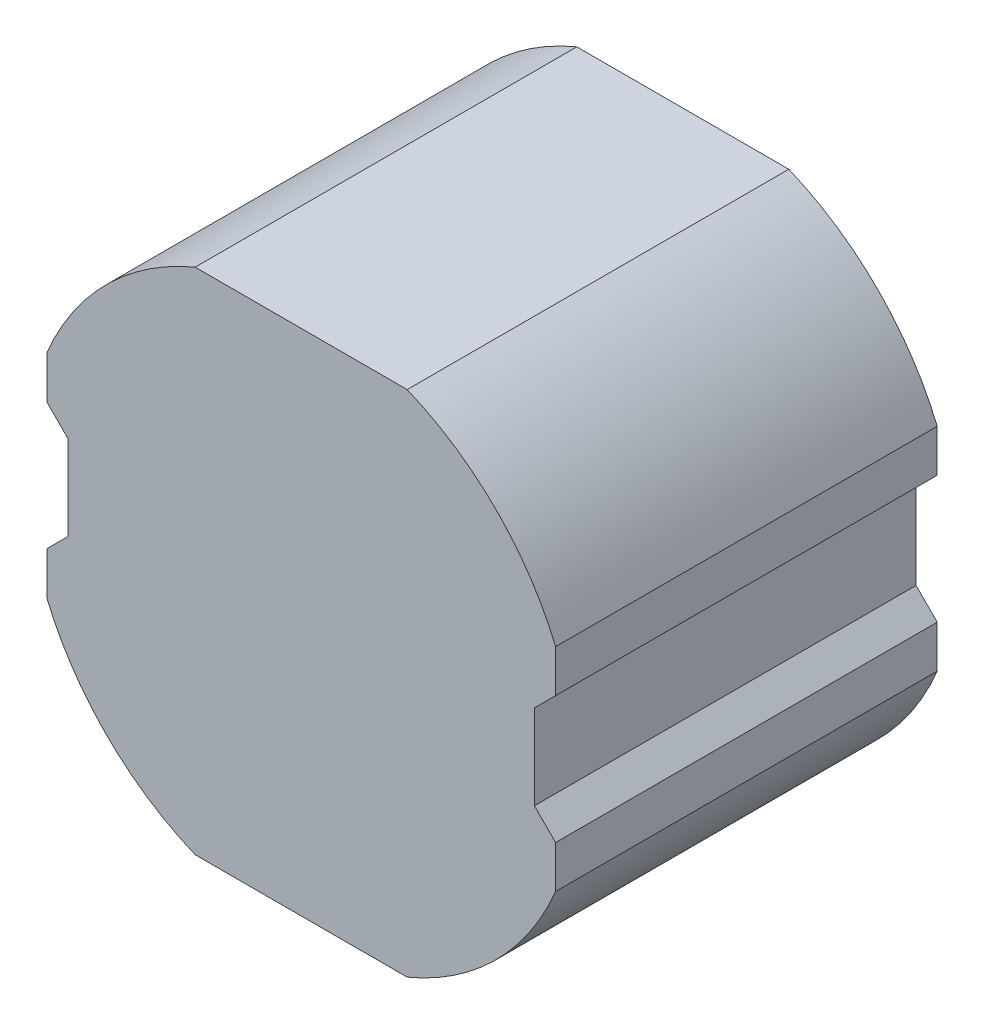
ISO-10303-21;
HEADER;
FILE_DESCRIPTION(('STEP AP214'),'2;1');
FILE_NAME('part.step','',(''),(''),'','','');
FILE_SCHEMA(('AUTOMOTIVE_DESIGN { 1 0 10303 214 1 1 1 1 }'));
ENDSEC;
DATA;
#1=APPLICATION_CONTEXT('core data for automotive mechanical design processes');
#2=APPLICATION_PROTOCOL_DEFINITION('international standard','automotive_design',2000,#1);
#3=PRODUCT_CONTEXT('',#1,'mechanical');
#4=PRODUCT('Part','Part','',(#3));
#5=PRODUCT_RELATED_PRODUCT_CATEGORY('part','',(#4));
#6=PRODUCT_DEFINITION_FORMATION('','',#4);
#7=PRODUCT_DEFINITION_CONTEXT('part definition',#1,'design');
#8=PRODUCT_DEFINITION('design','',#6,#7);
#9=PRODUCT_DEFINITION_SHAPE('','',#8);
#10=(LENGTH_UNIT() NAMED_UNIT(*) SI_UNIT(.MILLI.,.METRE.));
#11=(NAMED_UNIT(*) PLANE_ANGLE_UNIT() SI_UNIT($,.RADIAN.));
#12=(NAMED_UNIT(*) SI_UNIT($,.STERADIAN.) SOLID_ANGLE_UNIT());
#13=UNCERTAINTY_MEASURE_WITH_UNIT(LENGTH_MEASURE(1.E-05),#10,'distance_accuracy_value','');
#14=(GEOMETRIC_REPRESENTATION_CONTEXT(3) GLOBAL_UNCERTAINTY_ASSIGNED_CONTEXT((#13)) GLOBAL_UNIT_ASSIGNED_CONTEXT((#10,
#11,#12)) REPRESENTATION_CONTEXT('',''));
#15=CARTESIAN_POINT('',(0.,0.,0.));
#16=DIRECTION('',(0.,0.,1.));
#17=DIRECTION('',(1.,0.,0.));
#18=AXIS2_PLACEMENT_3D('',#15,#16,#17);
#19=CARTESIAN_POINT('',(2.749999938533,-0.509999988824,-0.01));
#20=CARTESIAN_POINT('',(2.749999938533,-0.509999988824,4.51));
#21=CARTESIAN_POINT('',(2.749999938533,0.509999988824,-0.01));
#22=CARTESIAN_POINT('',(2.749999938533,0.509999988824,4.51));
#23=(BOUNDED_SURFACE() B_SPLINE_SURFACE(1,1,((#19,#20),(#21,#22)),.UNSPECIFIED.,.F.,.F.,
.F.) B_SPLINE_SURFACE_WITH_KNOTS((2,2),(2,2),(-0.001,0.100999997765),(-0.001,0.451),
.UNSPECIFIED.) GEOMETRIC_REPRESENTATION_ITEM() RATIONAL_B_SPLINE_SURFACE(((1.,1.),(1.,1.))) REPRESENTATION_ITEM('') SURFACE());
#24=CARTESIAN_POINT('',(2.749999938533,0.499999988824,0.));
#25=CARTESIAN_POINT('',(2.749999938533,-0.499999988824,0.));
#26=(BOUNDED_CURVE() B_SPLINE_CURVE(1,(#24,#25),.UNSPECIFIED.,.F.,
.F.) B_SPLINE_CURVE_WITH_KNOTS((2,2),(0.,0.09999999776483),
.UNSPECIFIED.) CURVE() GEOMETRIC_REPRESENTATION_ITEM() RATIONAL_B_SPLINE_CURVE((1.,1.)) REPRESENTATION_ITEM(''));
#27=CARTESIAN_POINT('',(2.749999938533,0.499999988824,0.));
#28=VERTEX_POINT('',#27);
#29=CARTESIAN_POINT('',(2.749999938533,-0.499999988824,0.));
#30=VERTEX_POINT('',#29);
#31=EDGE_CURVE('E287',#28,#30,#26,.T.);
#32=CARTESIAN_POINT('',(2.749999938533,0.499999988824,0.));
#33=CARTESIAN_POINT('',(2.749999938533,0.499999988824,4.5));
#34=(BOUNDED_CURVE() B_SPLINE_CURVE(1,(#32,#33),.UNSPECIFIED.,.F.,
.F.) B_SPLINE_CURVE_WITH_KNOTS((2,2),(0.,0.45),
.UNSPECIFIED.) CURVE() GEOMETRIC_REPRESENTATION_ITEM() RATIONAL_B_SPLINE_CURVE((1.,1.)) REPRESENTATION_ITEM(''));
#35=CARTESIAN_POINT('',(2.749999938533,0.499999988824,4.5));
#36=VERTEX_POINT('',#35);
#37=EDGE_CURVE('E310',#28,#36,#34,.T.);
#38=CARTESIAN_POINT('',(2.749999938533,-0.499999988824,4.5));
#39=CARTESIAN_POINT('',(2.749999938533,0.499999988824,4.5));
#40=(BOUNDED_CURVE() B_SPLINE_CURVE(1,(#38,#39),.UNSPECIFIED.,.F.,
.F.) B_SPLINE_CURVE_WITH_KNOTS((2,2),(-0.09999999776483,0.),
.UNSPECIFIED.) CURVE() GEOMETRIC_REPRESENTATION_ITEM() RATIONAL_B_SPLINE_CURVE((1.,1.)) REPRESENTATION_ITEM(''));
#41=CARTESIAN_POINT('',(2.749999938533,-0.499999988824,4.5));
#42=VERTEX_POINT('',#41);
#43=EDGE_CURVE('E327',#42,#36,#40,.T.);
#44=CARTESIAN_POINT('',(2.749999938533,-0.499999988824,0.));
#45=CARTESIAN_POINT('',(2.749999938533,-0.499999988824,4.5));
#46=(BOUNDED_CURVE() B_SPLINE_CURVE(1,(#44,#45),.UNSPECIFIED.,.F.,
.F.) B_SPLINE_CURVE_WITH_KNOTS((2,2),(0.,0.45),
.UNSPECIFIED.) CURVE() GEOMETRIC_REPRESENTATION_ITEM() RATIONAL_B_SPLINE_CURVE((1.,1.)) REPRESENTATION_ITEM(''));
#47=EDGE_CURVE('E11',#30,#42,#46,.T.);
#48=ORIENTED_EDGE('',*,*,#31,.F.);
#49=ORIENTED_EDGE('',*,*,#37,.T.);
#50=ORIENTED_EDGE('',*,*,#43,.F.);
#51=ORIENTED_EDGE('',*,*,#47,.F.);
#52=EDGE_LOOP('',(#48,#49,#50,#51));
#53=FACE_BOUND('',#52,.T.);
#54=ADVANCED_FACE('F17',(#53),#23,.T.);
#55=CARTESIAN_POINT('',(3.007071000757,-0.757071051048,-0.01));
#56=CARTESIAN_POINT('',(3.007071000757,-0.757071051048,4.51));
#57=CARTESIAN_POINT('',(2.742928870721,-0.492928921012,-0.01));
#58=CARTESIAN_POINT('',(2.742928870721,-0.492928921012,4.51));
#59=(BOUNDED_SURFACE() B_SPLINE_SURFACE(1,1,((#55,#56),(#57,#58)),.UNSPECIFIED.,.F.,.F.,
.F.) B_SPLINE_SURFACE_WITH_KNOTS((2,2),(2,2),(-0.001,0.03635533826907),(-0.001,0.451),
.UNSPECIFIED.) GEOMETRIC_REPRESENTATION_ITEM() RATIONAL_B_SPLINE_SURFACE(((1.,1.),(1.,1.))) REPRESENTATION_ITEM('') SURFACE());
#60=CARTESIAN_POINT('',(2.749999938533,-0.499999988824,0.));
#61=CARTESIAN_POINT('',(2.999999932945,-0.749999983236,0.));
#62=(BOUNDED_CURVE() B_SPLINE_CURVE(1,(#60,#61),.UNSPECIFIED.,.F.,
.F.) B_SPLINE_CURVE_WITH_KNOTS((2,2),(0.,0.03535533826907),
.UNSPECIFIED.) CURVE() GEOMETRIC_REPRESENTATION_ITEM() RATIONAL_B_SPLINE_CURVE((1.,1.)) REPRESENTATION_ITEM(''));
#63=CARTESIAN_POINT('',(2.999999932945,-0.749999983236,0.));
#64=VERTEX_POINT('',#63);
#65=EDGE_CURVE('E286',#30,#64,#62,.T.);
#66=CARTESIAN_POINT('',(2.999999932945,-0.749999983236,4.5));
#67=CARTESIAN_POINT('',(2.749999938533,-0.499999988824,4.5));
#68=(BOUNDED_CURVE() B_SPLINE_CURVE(1,(#66,#67),.UNSPECIFIED.,.F.,
.F.) B_SPLINE_CURVE_WITH_KNOTS((2,2),(-0.03535533826907,0.),
.UNSPECIFIED.) CURVE() GEOMETRIC_REPRESENTATION_ITEM() RATIONAL_B_SPLINE_CURVE((1.,1.)) REPRESENTATION_ITEM(''));
#69=CARTESIAN_POINT('',(2.999999932945,-0.749999983236,4.5));
#70=VERTEX_POINT('',#69);
#71=EDGE_CURVE('E333',#70,#42,#68,.T.);
#72=CARTESIAN_POINT('',(2.999999932945,-0.749999983236,0.));
#73=CARTESIAN_POINT('',(2.999999932945,-0.749999983236,4.5));
#74=(BOUNDED_CURVE() B_SPLINE_CURVE(1,(#72,#73),.UNSPECIFIED.,.F.,
.F.) B_SPLINE_CURVE_WITH_KNOTS((2,2),(0.,0.45),
.UNSPECIFIED.) CURVE() GEOMETRIC_REPRESENTATION_ITEM() RATIONAL_B_SPLINE_CURVE((1.,1.)) REPRESENTATION_ITEM(''));
#75=EDGE_CURVE('E32',#64,#70,#74,.T.);
#76=ORIENTED_EDGE('',*,*,#65,.F.);
#77=ORIENTED_EDGE('',*,*,#47,.T.);
#78=ORIENTED_EDGE('',*,*,#71,.F.);
#79=ORIENTED_EDGE('',*,*,#75,.F.);
#80=EDGE_LOOP('',(#76,#77,#78,#79));
#81=FACE_BOUND('',#80,.T.);
#82=ADVANCED_FACE('F748',(#81),#59,.T.);
#83=CARTESIAN_POINT('',(3.000000001341,-1.26,-0.01));
#84=CARTESIAN_POINT('',(3.000000001341,-1.26,4.51));
#85=CARTESIAN_POINT('',(2.999999931604,-0.739999983236,-0.01));
#86=CARTESIAN_POINT('',(2.999999931604,-0.739999983236,4.51));
#87=(BOUNDED_SURFACE() B_SPLINE_SURFACE(1,1,((#83,#84),(#85,#86)),.UNSPECIFIED.,.F.,.F.,
.F.) B_SPLINE_SURFACE_WITH_KNOTS((2,2),(2,2),(-0.001,0.05100000167638),(-0.001,0.451),
.UNSPECIFIED.) GEOMETRIC_REPRESENTATION_ITEM() RATIONAL_B_SPLINE_SURFACE(((1.,1.),(1.,1.))) REPRESENTATION_ITEM('') SURFACE());
#88=CARTESIAN_POINT('',(2.999999932945,-0.749999983236,0.));
#89=CARTESIAN_POINT('',(3.,-1.25,0.));
#90=(BOUNDED_CURVE() B_SPLINE_CURVE(1,(#88,#89),.UNSPECIFIED.,.F.,
.F.) B_SPLINE_CURVE_WITH_KNOTS((2,2),(0.,0.05000000167638),
.UNSPECIFIED.) CURVE() GEOMETRIC_REPRESENTATION_ITEM() RATIONAL_B_SPLINE_CURVE((1.,1.)) REPRESENTATION_ITEM(''));
#91=CARTESIAN_POINT('',(3.,-1.25,0.));
#92=VERTEX_POINT('',#91);
#93=EDGE_CURVE('E276',#64,#92,#90,.T.);
#94=CARTESIAN_POINT('',(3.,-1.25,4.5));
#95=CARTESIAN_POINT('',(2.999999932945,-0.749999983236,4.5));
#96=(BOUNDED_CURVE() B_SPLINE_CURVE(1,(#94,#95),.UNSPECIFIED.,.F.,
.F.) B_SPLINE_CURVE_WITH_KNOTS((2,2),(-0.05000000167638,0.),
.UNSPECIFIED.) CURVE() GEOMETRIC_REPRESENTATION_ITEM() RATIONAL_B_SPLINE_CURVE((1.,1.)) REPRESENTATION_ITEM(''));
#97=CARTESIAN_POINT('',(3.,-1.25,4.5));
#98=VERTEX_POINT('',#97);
#99=EDGE_CURVE('E354',#98,#70,#96,.T.);
#100=CARTESIAN_POINT('',(3.,-1.25,0.));
#101=CARTESIAN_POINT('',(3.,-1.25,4.5));
#102=(BOUNDED_CURVE() B_SPLINE_CURVE(1,(#100,#101),.UNSPECIFIED.,.F.,
.F.) B_SPLINE_CURVE_WITH_KNOTS((2,2),(0.,0.45),
.UNSPECIFIED.) CURVE() GEOMETRIC_REPRESENTATION_ITEM() RATIONAL_B_SPLINE_CURVE((1.,1.)) REPRESENTATION_ITEM(''));
#103=EDGE_CURVE('E156',#92,#98,#102,.T.);
#104=ORIENTED_EDGE('',*,*,#93,.F.);
#105=ORIENTED_EDGE('',*,*,#75,.T.);
#106=ORIENTED_EDGE('',*,*,#99,.F.);
#107=ORIENTED_EDGE('',*,*,#103,.F.);
#108=EDGE_LOOP('',(#104,#105,#106,#107));
#109=FACE_BOUND('',#108,.T.);
#110=ADVANCED_FACE('F754',(#109),#87,.T.);
#111=CARTESIAN_POINT('',(1.25,-3.,4.5));
#112=CARTESIAN_POINT('',(2.485294117647,-2.485294117647,4.5));
#113=CARTESIAN_POINT('',(3.,-1.25,4.5));
#114=CARTESIAN_POINT('',(1.25,-3.,0.));
#115=CARTESIAN_POINT('',(2.485294117647,-2.485294117647,0.));
#116=CARTESIAN_POINT('',(3.,-1.25,0.));
#117=(BOUNDED_SURFACE() B_SPLINE_SURFACE(1,2,((#111,#112,#113),(#114,#115,#116)),.UNSPECIFIED.,
.F.,.F.,.F.) B_SPLINE_SURFACE_WITH_KNOTS((2,2),(3,3),(0.,1.384615384615),(0.,0.781214087395),
.UNSPECIFIED.) GEOMETRIC_REPRESENTATION_ITEM() RATIONAL_B_SPLINE_SURFACE(((1.,0.924678098475,
1.),(1.,0.924678098475,1.))) REPRESENTATION_ITEM('') SURFACE());
#118=CARTESIAN_POINT('',(1.25,-3.,0.));
#119=CARTESIAN_POINT('',(2.485294117647,-2.485294117647,0.));
#120=CARTESIAN_POINT('',(3.,-1.25,0.));
#121=(BOUNDED_CURVE() B_SPLINE_CURVE(2,(#118,#119,#120),.UNSPECIFIED.,.F.,
.F.) B_SPLINE_CURVE_WITH_KNOTS((3,3),(0.,0.781214087395),
.UNSPECIFIED.) CURVE() GEOMETRIC_REPRESENTATION_ITEM() RATIONAL_B_SPLINE_CURVE((1.,
0.924678098475,1.)) REPRESENTATION_ITEM(''));
#122=CARTESIAN_POINT('',(1.25,-3.,0.));
#123=VERTEX_POINT('',#122);
#124=EDGE_CURVE('E285',#123,#92,#121,.T.);
#125=CARTESIAN_POINT('',(1.25,-3.,4.5));
#126=CARTESIAN_POINT('',(2.485294117647,-2.485294117647,4.5));
#127=CARTESIAN_POINT('',(3.,-1.25,4.5));
#128=(BOUNDED_CURVE() B_SPLINE_CURVE(2,(#125,#126,#127),.UNSPECIFIED.,.F.,
.F.) B_SPLINE_CURVE_WITH_KNOTS((3,3),(0.,0.781214087395),
.UNSPECIFIED.) CURVE() GEOMETRIC_REPRESENTATION_ITEM() RATIONAL_B_SPLINE_CURVE((1.,
0.924678098475,1.)) REPRESENTATION_ITEM(''));
#129=CARTESIAN_POINT('',(1.25,-3.,4.5));
#130=VERTEX_POINT('',#129);
#131=EDGE_CURVE('E362',#130,#98,#128,.T.);
#132=CARTESIAN_POINT('',(1.25,-3.,0.));
#133=CARTESIAN_POINT('',(1.25,-3.,4.5));
#134=(BOUNDED_CURVE() B_SPLINE_CURVE(1,(#132,#133),.UNSPECIFIED.,.F.,
.F.) B_SPLINE_CURVE_WITH_KNOTS((2,2),(0.,0.45),
.UNSPECIFIED.) CURVE() GEOMETRIC_REPRESENTATION_ITEM() RATIONAL_B_SPLINE_CURVE((1.,1.)) REPRESENTATION_ITEM(''));
#135=EDGE_CURVE('E146',#123,#130,#134,.T.);
#136=ORIENTED_EDGE('',*,*,#124,.T.);
#137=ORIENTED_EDGE('',*,*,#103,.T.);
#138=ORIENTED_EDGE('',*,*,#131,.F.);
#139=ORIENTED_EDGE('',*,*,#135,.F.);
#140=EDGE_LOOP('',(#136,#137,#138,#139));
#141=FACE_BOUND('',#140,.T.);
#142=ADVANCED_FACE('F784',(#141),#117,.T.);
#143=CARTESIAN_POINT('',(-1.26,-3.,-0.01));
#144=CARTESIAN_POINT('',(-1.26,-3.,4.51));
#145=CARTESIAN_POINT('',(1.26,-3.,-0.01));
#146=CARTESIAN_POINT('',(1.26,-3.,4.51));
#147=(BOUNDED_SURFACE() B_SPLINE_SURFACE(1,1,((#143,#144),(#145,#146)),.UNSPECIFIED.,.F.,.F.,
.F.) B_SPLINE_SURFACE_WITH_KNOTS((2,2),(2,2),(-0.001,0.251),(-0.001,0.451),
.UNSPECIFIED.) GEOMETRIC_REPRESENTATION_ITEM() RATIONAL_B_SPLINE_SURFACE(((1.,1.),(1.,1.))) REPRESENTATION_ITEM('') SURFACE());
#148=CARTESIAN_POINT('',(1.25,-3.,0.));
#149=CARTESIAN_POINT('',(-1.25,-3.,0.));
#150=(BOUNDED_CURVE() B_SPLINE_CURVE(1,(#148,#149),.UNSPECIFIED.,.F.,
.F.) B_SPLINE_CURVE_WITH_KNOTS((2,2),(0.,0.25),
.UNSPECIFIED.) CURVE() GEOMETRIC_REPRESENTATION_ITEM() RATIONAL_B_SPLINE_CURVE((1.,1.)) REPRESENTATION_ITEM(''));
#151=CARTESIAN_POINT('',(-1.25,-3.,0.));
#152=VERTEX_POINT('',#151);
#153=EDGE_CURVE('E337',#123,#152,#150,.T.);
#154=CARTESIAN_POINT('',(-1.25,-3.,4.5));
#155=CARTESIAN_POINT('',(1.25,-3.,4.5));
#156=(BOUNDED_CURVE() B_SPLINE_CURVE(1,(#154,#155),.UNSPECIFIED.,.F.,
.F.) B_SPLINE_CURVE_WITH_KNOTS((2,2),(-0.25,0.),
.UNSPECIFIED.) CURVE() GEOMETRIC_REPRESENTATION_ITEM() RATIONAL_B_SPLINE_CURVE((1.,1.)) REPRESENTATION_ITEM(''));
#157=CARTESIAN_POINT('',(-1.25,-3.,4.5));
#158=VERTEX_POINT('',#157);
#159=EDGE_CURVE('E245',#158,#130,#156,.T.);
#160=CARTESIAN_POINT('',(-1.25,-3.,0.));
#161=CARTESIAN_POINT('',(-1.25,-3.,4.5));
#162=(BOUNDED_CURVE() B_SPLINE_CURVE(1,(#160,#161),.UNSPECIFIED.,.F.,
.F.) B_SPLINE_CURVE_WITH_KNOTS((2,2),(0.,0.45),
.UNSPECIFIED.) CURVE() GEOMETRIC_REPRESENTATION_ITEM() RATIONAL_B_SPLINE_CURVE((1.,1.)) REPRESENTATION_ITEM(''));
#163=EDGE_CURVE('E139',#152,#158,#162,.T.);
#164=ORIENTED_EDGE('',*,*,#153,.F.);
#165=ORIENTED_EDGE('',*,*,#135,.T.);
#166=ORIENTED_EDGE('',*,*,#159,.F.);
#167=ORIENTED_EDGE('',*,*,#163,.F.);
#168=EDGE_LOOP('',(#164,#165,#166,#167));
#169=FACE_BOUND('',#168,.T.);
#170=ADVANCED_FACE('F19',(#169),#147,.T.);
#171=CARTESIAN_POINT('',(-3.,-1.25,4.5));
#172=CARTESIAN_POINT('',(-2.485294117647,-2.485294117647,4.5));
#173=CARTESIAN_POINT('',(-1.25,-3.,4.5));
#174=CARTESIAN_POINT('',(-3.,-1.25,0.));
#175=CARTESIAN_POINT('',(-2.485294117647,-2.485294117647,0.));
#176=CARTESIAN_POINT('',(-1.25,-3.,0.));
#177=(BOUNDED_SURFACE() B_SPLINE_SURFACE(1,2,((#171,#172,#173),(#174,#175,#176)),.UNSPECIFIED.,
.F.,.F.,.F.) B_SPLINE_SURFACE_WITH_KNOTS((2,2),(3,3),(0.,1.384615384615),(0.,0.781214087395),
.UNSPECIFIED.) GEOMETRIC_REPRESENTATION_ITEM() RATIONAL_B_SPLINE_SURFACE(((1.,0.924678098475,
1.),(1.,0.924678098475,1.))) REPRESENTATION_ITEM('') SURFACE());
#178=CARTESIAN_POINT('',(-3.,-1.25,0.));
#179=CARTESIAN_POINT('',(-2.485294117647,-2.485294117647,0.));
#180=CARTESIAN_POINT('',(-1.25,-3.,0.));
#181=(BOUNDED_CURVE() B_SPLINE_CURVE(2,(#178,#179,#180),.UNSPECIFIED.,.F.,
.F.) B_SPLINE_CURVE_WITH_KNOTS((3,3),(0.,0.781214087395),
.UNSPECIFIED.) CURVE() GEOMETRIC_REPRESENTATION_ITEM() RATIONAL_B_SPLINE_CURVE((1.,
0.924678098475,1.)) REPRESENTATION_ITEM(''));
#182=CARTESIAN_POINT('',(-3.,-1.25,0.));
#183=VERTEX_POINT('',#182);
#184=EDGE_CURVE('E257',#183,#152,#181,.T.);
#185=CARTESIAN_POINT('',(-3.,-1.25,4.5));
#186=CARTESIAN_POINT('',(-2.485294117647,-2.485294117647,4.5));
#187=CARTESIAN_POINT('',(-1.25,-3.,4.5));
#188=(BOUNDED_CURVE() B_SPLINE_CURVE(2,(#185,#186,#187),.UNSPECIFIED.,.F.,
.F.) B_SPLINE_CURVE_WITH_KNOTS((3,3),(0.,0.781214087395),
.UNSPECIFIED.) CURVE() GEOMETRIC_REPRESENTATION_ITEM() RATIONAL_B_SPLINE_CURVE((1.,
0.924678098475,1.)) REPRESENTATION_ITEM(''));
#189=CARTESIAN_POINT('',(-3.,-1.25,4.5));
#190=VERTEX_POINT('',#189);
#191=EDGE_CURVE('E236',#190,#158,#188,.T.);
#192=CARTESIAN_POINT('',(-3.,-1.25,0.));
#193=CARTESIAN_POINT('',(-3.,-1.25,4.5));
#194=(BOUNDED_CURVE() B_SPLINE_CURVE(1,(#192,#193),.UNSPECIFIED.,.F.,
.F.) B_SPLINE_CURVE_WITH_KNOTS((2,2),(0.,0.45),
.UNSPECIFIED.) CURVE() GEOMETRIC_REPRESENTATION_ITEM() RATIONAL_B_SPLINE_CURVE((1.,1.)) REPRESENTATION_ITEM(''));
#195=EDGE_CURVE('E23',#183,#190,#194,.T.);
#196=ORIENTED_EDGE('',*,*,#184,.T.);
#197=ORIENTED_EDGE('',*,*,#163,.T.);
#198=ORIENTED_EDGE('',*,*,#191,.F.);
#199=ORIENTED_EDGE('',*,*,#195,.F.);
#200=EDGE_LOOP('',(#196,#197,#198,#199));
#201=FACE_BOUND('',#200,.T.);
#202=ADVANCED_FACE('F579',(#201),#177,.T.);
#203=CARTESIAN_POINT('',(-3.,-0.74,-0.01));
#204=CARTESIAN_POINT('',(-3.,-0.74,4.51));
#205=CARTESIAN_POINT('',(-3.,-1.26,-0.01));
#206=CARTESIAN_POINT('',(-3.,-1.26,4.51));
#207=(BOUNDED_SURFACE() B_SPLINE_SURFACE(1,1,((#203,#204),(#205,#206)),.UNSPECIFIED.,.F.,.F.,
.F.) B_SPLINE_SURFACE_WITH_KNOTS((2,2),(2,2),(-0.001,0.051),(-0.001,0.451),
.UNSPECIFIED.) GEOMETRIC_REPRESENTATION_ITEM() RATIONAL_B_SPLINE_SURFACE(((1.,1.),(1.,1.))) REPRESENTATION_ITEM('') SURFACE());
#208=CARTESIAN_POINT('',(-3.,-1.25,0.));
#209=CARTESIAN_POINT('',(-3.,-0.75,0.));
#210=(BOUNDED_CURVE() B_SPLINE_CURVE(1,(#208,#209),.UNSPECIFIED.,.F.,
.F.) B_SPLINE_CURVE_WITH_KNOTS((2,2),(0.,0.05),
.UNSPECIFIED.) CURVE() GEOMETRIC_REPRESENTATION_ITEM() RATIONAL_B_SPLINE_CURVE((1.,1.)) REPRESENTATION_ITEM(''));
#211=CARTESIAN_POINT('',(-3.,-0.75,0.));
#212=VERTEX_POINT('',#211);
#213=EDGE_CURVE('E247',#183,#212,#210,.T.);
#214=CARTESIAN_POINT('',(-3.,-0.75,4.5));
#215=CARTESIAN_POINT('',(-3.,-1.25,4.5));
#216=(BOUNDED_CURVE() B_SPLINE_CURVE(1,(#214,#215),.UNSPECIFIED.,.F.,
.F.) B_SPLINE_CURVE_WITH_KNOTS((2,2),(-0.05,0.),
.UNSPECIFIED.) CURVE() GEOMETRIC_REPRESENTATION_ITEM() RATIONAL_B_SPLINE_CURVE((1.,1.)) REPRESENTATION_ITEM(''));
#217=CARTESIAN_POINT('',(-3.,-0.75,4.5));
#218=VERTEX_POINT('',#217);
#219=EDGE_CURVE('E246',#218,#190,#216,.T.);
#220=CARTESIAN_POINT('',(-3.,-0.75,0.));
#221=CARTESIAN_POINT('',(-3.,-0.75,4.5));
#222=(BOUNDED_CURVE() B_SPLINE_CURVE(1,(#220,#221),.UNSPECIFIED.,.F.,
.F.) B_SPLINE_CURVE_WITH_KNOTS((2,2),(0.,0.45),
.UNSPECIFIED.) CURVE() GEOMETRIC_REPRESENTATION_ITEM() RATIONAL_B_SPLINE_CURVE((1.,1.)) REPRESENTATION_ITEM(''));
#223=EDGE_CURVE('E456',#212,#218,#222,.T.);
#224=ORIENTED_EDGE('',*,*,#213,.F.);
#225=ORIENTED_EDGE('',*,*,#195,.T.);
#226=ORIENTED_EDGE('',*,*,#219,.F.);
#227=ORIENTED_EDGE('',*,*,#223,.F.);
#228=EDGE_LOOP('',(#224,#225,#226,#227));
#229=FACE_BOUND('',#228,.T.);
#230=ADVANCED_FACE('F588',(#229),#207,.T.);
#231=CARTESIAN_POINT('',(-2.742928932188,-0.492928932188,-0.01));
#232=CARTESIAN_POINT('',(-2.742928932188,-0.492928932188,4.51));
#233=CARTESIAN_POINT('',(-3.007071067812,-0.757071067812,-0.01));
#234=CARTESIAN_POINT('',(-3.007071067812,-0.757071067812,4.51));
#235=(BOUNDED_SURFACE() B_SPLINE_SURFACE(1,1,((#231,#232),(#233,#234)),.UNSPECIFIED.,.F.,.F.,
.F.) B_SPLINE_SURFACE_WITH_KNOTS((2,2),(2,2),(-0.001,0.03635533905933),(-0.001,0.451),
.UNSPECIFIED.) GEOMETRIC_REPRESENTATION_ITEM() RATIONAL_B_SPLINE_SURFACE(((1.,1.),(1.,1.))) REPRESENTATION_ITEM('') SURFACE());
#236=CARTESIAN_POINT('',(-2.75,-0.5,0.));
#237=CARTESIAN_POINT('',(-3.,-0.75,0.));
#238=(BOUNDED_CURVE() B_SPLINE_CURVE(1,(#236,#237),.UNSPECIFIED.,.F.,
.F.) B_SPLINE_CURVE_WITH_KNOTS((2,2),(0.,0.03535533905933),
.UNSPECIFIED.) CURVE() GEOMETRIC_REPRESENTATION_ITEM() RATIONAL_B_SPLINE_CURVE((1.,1.)) REPRESENTATION_ITEM(''));
#239=CARTESIAN_POINT('',(-2.75,-0.5,0.));
#240=VERTEX_POINT('',#239);
#241=EDGE_CURVE('E256',#240,#212,#238,.T.);
#242=CARTESIAN_POINT('',(-2.75,-0.5,4.5));
#243=CARTESIAN_POINT('',(-3.,-0.75,4.5));
#244=(BOUNDED_CURVE() B_SPLINE_CURVE(1,(#242,#243),.UNSPECIFIED.,.F.,
.F.) B_SPLINE_CURVE_WITH_KNOTS((2,2),(0.,0.03535533905933),
.UNSPECIFIED.) CURVE() GEOMETRIC_REPRESENTATION_ITEM() RATIONAL_B_SPLINE_CURVE((1.,1.)) REPRESENTATION_ITEM(''));
#245=CARTESIAN_POINT('',(-2.75,-0.5,4.5));
#246=VERTEX_POINT('',#245);
#247=EDGE_CURVE('E412',#246,#218,#244,.T.);
#248=CARTESIAN_POINT('',(-2.75,-0.5,0.));
#249=CARTESIAN_POINT('',(-2.75,-0.5,4.5));
#250=(BOUNDED_CURVE() B_SPLINE_CURVE(1,(#248,#249),.UNSPECIFIED.,.F.,
.F.) B_SPLINE_CURVE_WITH_KNOTS((2,2),(0.,0.45),
.UNSPECIFIED.) CURVE() GEOMETRIC_REPRESENTATION_ITEM() RATIONAL_B_SPLINE_CURVE((1.,1.)) REPRESENTATION_ITEM(''));
#251=EDGE_CURVE('E448',#240,#246,#250,.T.);
#252=ORIENTED_EDGE('',*,*,#241,.T.);
#253=ORIENTED_EDGE('',*,*,#223,.T.);
#254=ORIENTED_EDGE('',*,*,#247,.F.);
#255=ORIENTED_EDGE('',*,*,#251,.F.);
#256=EDGE_LOOP('',(#252,#253,#254,#255));
#257=FACE_BOUND('',#256,.T.);
#258=ADVANCED_FACE('F759',(#257),#235,.T.);
#259=CARTESIAN_POINT('',(-2.75,0.51,-0.01));
#260=CARTESIAN_POINT('',(-2.75,0.51,4.51));
#261=CARTESIAN_POINT('',(-2.75,-0.51,-0.01));
#262=CARTESIAN_POINT('',(-2.75,-0.51,4.51));
#263=(BOUNDED_SURFACE() B_SPLINE_SURFACE(1,1,((#259,#260),(#261,#262)),.UNSPECIFIED.,.F.,.F.,
.F.) B_SPLINE_SURFACE_WITH_KNOTS((2,2),(2,2),(-0.001,0.101),(-0.001,0.451),
.UNSPECIFIED.) GEOMETRIC_REPRESENTATION_ITEM() RATIONAL_B_SPLINE_SURFACE(((1.,1.),(1.,1.))) REPRESENTATION_ITEM('') SURFACE());
#264=CARTESIAN_POINT('',(-2.75,0.5,0.));
#265=CARTESIAN_POINT('',(-2.75,-0.5,0.));
#266=(BOUNDED_CURVE() B_SPLINE_CURVE(1,(#264,#265),.UNSPECIFIED.,.F.,
.F.) B_SPLINE_CURVE_WITH_KNOTS((2,2),(0.,0.1),
.UNSPECIFIED.) CURVE() GEOMETRIC_REPRESENTATION_ITEM() RATIONAL_B_SPLINE_CURVE((1.,1.)) REPRESENTATION_ITEM(''));
#267=CARTESIAN_POINT('',(-2.75,0.5,0.));
#268=VERTEX_POINT('',#267);
#269=EDGE_CURVE('E421',#268,#240,#266,.T.);
#270=CARTESIAN_POINT('',(-2.75,0.5,4.5));
#271=CARTESIAN_POINT('',(-2.75,-0.5,4.5));
#272=(BOUNDED_CURVE() B_SPLINE_CURVE(1,(#270,#271),.UNSPECIFIED.,.F.,
.F.) B_SPLINE_CURVE_WITH_KNOTS((2,2),(0.,0.1),
.UNSPECIFIED.) CURVE() GEOMETRIC_REPRESENTATION_ITEM() RATIONAL_B_SPLINE_CURVE((1.,1.)) REPRESENTATION_ITEM(''));
#273=CARTESIAN_POINT('',(-2.75,0.5,4.5));
#274=VERTEX_POINT('',#273);
#275=EDGE_CURVE('E274',#274,#246,#272,.T.);
#276=CARTESIAN_POINT('',(-2.75,0.5,0.));
#277=CARTESIAN_POINT('',(-2.75,0.5,4.5));
#278=(BOUNDED_CURVE() B_SPLINE_CURVE(1,(#276,#277),.UNSPECIFIED.,.F.,
.F.) B_SPLINE_CURVE_WITH_KNOTS((2,2),(0.,0.45),
.UNSPECIFIED.) CURVE() GEOMETRIC_REPRESENTATION_ITEM() RATIONAL_B_SPLINE_CURVE((1.,1.)) REPRESENTATION_ITEM(''));
#279=EDGE_CURVE('E227',#268,#274,#278,.T.);
#280=ORIENTED_EDGE('',*,*,#269,.T.);
#281=ORIENTED_EDGE('',*,*,#251,.T.);
#282=ORIENTED_EDGE('',*,*,#275,.F.);
#283=ORIENTED_EDGE('',*,*,#279,.F.);
#284=EDGE_LOOP('',(#280,#281,#282,#283));
#285=FACE_BOUND('',#284,.T.);
#286=ADVANCED_FACE('F918',(#285),#263,.T.);
#287=CARTESIAN_POINT('',(-3.007071067812,0.757071067812,-0.01));
#288=CARTESIAN_POINT('',(-3.007071067812,0.757071067812,4.51));
#289=CARTESIAN_POINT('',(-2.742928932188,0.492928932188,-0.01));
#290=CARTESIAN_POINT('',(-2.742928932188,0.492928932188,4.51));
#291=(BOUNDED_SURFACE() B_SPLINE_SURFACE(1,1,((#287,#288),(#289,#290)),.UNSPECIFIED.,.F.,.F.,
.F.) B_SPLINE_SURFACE_WITH_KNOTS((2,2),(2,2),(-0.001,0.03635533905933),(-0.001,0.451),
.UNSPECIFIED.) GEOMETRIC_REPRESENTATION_ITEM() RATIONAL_B_SPLINE_SURFACE(((1.,1.),(1.,1.))) REPRESENTATION_ITEM('') SURFACE());
#292=CARTESIAN_POINT('',(-3.,0.75,0.));
#293=CARTESIAN_POINT('',(-2.75,0.5,0.));
#294=(BOUNDED_CURVE() B_SPLINE_CURVE(1,(#292,#293),.UNSPECIFIED.,.F.,
.F.) B_SPLINE_CURVE_WITH_KNOTS((2,2),(0.,0.03535533905933),
.UNSPECIFIED.) CURVE() GEOMETRIC_REPRESENTATION_ITEM() RATIONAL_B_SPLINE_CURVE((1.,1.)) REPRESENTATION_ITEM(''));
#295=CARTESIAN_POINT('',(-3.,0.75,0.));
#296=VERTEX_POINT('',#295);
#297=EDGE_CURVE('E422',#296,#268,#294,.T.);
#298=CARTESIAN_POINT('',(-3.,0.75,4.5));
#299=CARTESIAN_POINT('',(-2.75,0.5,4.5));
#300=(BOUNDED_CURVE() B_SPLINE_CURVE(1,(#298,#299),.UNSPECIFIED.,.F.,
.F.) B_SPLINE_CURVE_WITH_KNOTS((2,2),(0.,0.03535533905933),
.UNSPECIFIED.) CURVE() GEOMETRIC_REPRESENTATION_ITEM() RATIONAL_B_SPLINE_CURVE((1.,1.)) REPRESENTATION_ITEM(''));
#301=CARTESIAN_POINT('',(-3.,0.75,4.5));
#302=VERTEX_POINT('',#301);
#303=EDGE_CURVE('E265',#302,#274,#300,.T.);
#304=CARTESIAN_POINT('',(-3.,0.75,0.));
#305=CARTESIAN_POINT('',(-3.,0.75,4.5));
#306=(BOUNDED_CURVE() B_SPLINE_CURVE(1,(#304,#305),.UNSPECIFIED.,.F.,
.F.) B_SPLINE_CURVE_WITH_KNOTS((2,2),(0.,0.45),
.UNSPECIFIED.) CURVE() GEOMETRIC_REPRESENTATION_ITEM() RATIONAL_B_SPLINE_CURVE((1.,1.)) REPRESENTATION_ITEM(''));
#307=EDGE_CURVE('E219',#296,#302,#306,.T.);
#308=ORIENTED_EDGE('',*,*,#297,.T.);
#309=ORIENTED_EDGE('',*,*,#279,.T.);
#310=ORIENTED_EDGE('',*,*,#303,.F.);
#311=ORIENTED_EDGE('',*,*,#307,.F.);
#312=EDGE_LOOP('',(#308,#309,#310,#311));
#313=FACE_BOUND('',#312,.T.);
#314=ADVANCED_FACE('F907',(#313),#291,.T.);
#315=CARTESIAN_POINT('',(-3.,1.26,-0.01));
#316=CARTESIAN_POINT('',(-3.,1.26,4.51));
#317=CARTESIAN_POINT('',(-3.,0.74,-0.01));
#318=CARTESIAN_POINT('',(-3.,0.74,4.51));
#319=(BOUNDED_SURFACE() B_SPLINE_SURFACE(1,1,((#315,#316),(#317,#318)),.UNSPECIFIED.,.F.,.F.,
.F.) B_SPLINE_SURFACE_WITH_KNOTS((2,2),(2,2),(-0.001,0.051),(-0.001,0.451),
.UNSPECIFIED.) GEOMETRIC_REPRESENTATION_ITEM() RATIONAL_B_SPLINE_SURFACE(((1.,1.),(1.,1.))) REPRESENTATION_ITEM('') SURFACE());
#320=CARTESIAN_POINT('',(-3.,0.75,0.));
#321=CARTESIAN_POINT('',(-3.,1.25,0.));
#322=(BOUNDED_CURVE() B_SPLINE_CURVE(1,(#320,#321),.UNSPECIFIED.,.F.,
.F.) B_SPLINE_CURVE_WITH_KNOTS((2,2),(0.,0.05),
.UNSPECIFIED.) CURVE() GEOMETRIC_REPRESENTATION_ITEM() RATIONAL_B_SPLINE_CURVE((1.,1.)) REPRESENTATION_ITEM(''));
#323=CARTESIAN_POINT('',(-3.,1.25,0.));
#324=VERTEX_POINT('',#323);
#325=EDGE_CURVE('E431',#296,#324,#322,.T.);
#326=CARTESIAN_POINT('',(-3.,1.25,4.5));
#327=CARTESIAN_POINT('',(-3.,0.75,4.5));
#328=(BOUNDED_CURVE() B_SPLINE_CURVE(1,(#326,#327),.UNSPECIFIED.,.F.,
.F.) B_SPLINE_CURVE_WITH_KNOTS((2,2),(-0.05,0.),
.UNSPECIFIED.) CURVE() GEOMETRIC_REPRESENTATION_ITEM() RATIONAL_B_SPLINE_CURVE((1.,1.)) REPRESENTATION_ITEM(''));
#329=CARTESIAN_POINT('',(-3.,1.25,4.5));
#330=VERTEX_POINT('',#329);
#331=EDGE_CURVE('E275',#330,#302,#328,.T.);
#332=CARTESIAN_POINT('',(-3.,1.25,0.));
#333=CARTESIAN_POINT('',(-3.,1.25,4.5));
#334=(BOUNDED_CURVE() B_SPLINE_CURVE(1,(#332,#333),.UNSPECIFIED.,.F.,
.F.) B_SPLINE_CURVE_WITH_KNOTS((2,2),(0.,0.45),
.UNSPECIFIED.) CURVE() GEOMETRIC_REPRESENTATION_ITEM() RATIONAL_B_SPLINE_CURVE((1.,1.)) REPRESENTATION_ITEM(''));
#335=EDGE_CURVE('E228',#324,#330,#334,.T.);
#336=ORIENTED_EDGE('',*,*,#325,.F.);
#337=ORIENTED_EDGE('',*,*,#307,.T.);
#338=ORIENTED_EDGE('',*,*,#331,.F.);
#339=ORIENTED_EDGE('',*,*,#335,.F.);
#340=EDGE_LOOP('',(#336,#337,#338,#339));
#341=FACE_BOUND('',#340,.T.);
#342=ADVANCED_FACE('F773',(#341),#319,.T.);
#343=CARTESIAN_POINT('',(-1.25,3.,4.5));
#344=CARTESIAN_POINT('',(-2.485294117647,2.485294117647,4.5));
#345=CARTESIAN_POINT('',(-3.,1.25,4.5));
#346=CARTESIAN_POINT('',(-1.25,3.,0.));
#347=CARTESIAN_POINT('',(-2.485294117647,2.485294117647,0.));
#348=CARTESIAN_POINT('',(-3.,1.25,0.));
#349=(BOUNDED_SURFACE() B_SPLINE_SURFACE(1,2,((#343,#344,#345),(#346,#347,#348)),.UNSPECIFIED.,
.F.,.F.,.F.) B_SPLINE_SURFACE_WITH_KNOTS((2,2),(3,3),(0.,1.384615384615),(0.,0.781214087395),
.UNSPECIFIED.) GEOMETRIC_REPRESENTATION_ITEM() RATIONAL_B_SPLINE_SURFACE(((1.,0.924678098475,
1.),(1.,0.924678098475,1.))) REPRESENTATION_ITEM('') SURFACE());
#350=CARTESIAN_POINT('',(-1.25,3.,0.));
#351=CARTESIAN_POINT('',(-2.485294117647,2.485294117647,0.));
#352=CARTESIAN_POINT('',(-3.,1.25,0.));
#353=(BOUNDED_CURVE() B_SPLINE_CURVE(2,(#350,#351,#352),.UNSPECIFIED.,.F.,
.F.) B_SPLINE_CURVE_WITH_KNOTS((3,3),(0.,0.781214087395),
.UNSPECIFIED.) CURVE() GEOMETRIC_REPRESENTATION_ITEM() RATIONAL_B_SPLINE_CURVE((1.,
0.924678098475,1.)) REPRESENTATION_ITEM(''));
#354=CARTESIAN_POINT('',(-1.25,3.,0.));
#355=VERTEX_POINT('',#354);
#356=EDGE_CURVE('E432',#355,#324,#353,.T.);
#357=CARTESIAN_POINT('',(-1.25,3.,4.5));
#358=CARTESIAN_POINT('',(-2.485294117647,2.485294117647,4.5));
#359=CARTESIAN_POINT('',(-3.,1.25,4.5));
#360=(BOUNDED_CURVE() B_SPLINE_CURVE(2,(#357,#358,#359),.UNSPECIFIED.,.F.,
.F.) B_SPLINE_CURVE_WITH_KNOTS((3,3),(0.,0.781214087395),
.UNSPECIFIED.) CURVE() GEOMETRIC_REPRESENTATION_ITEM() RATIONAL_B_SPLINE_CURVE((1.,
0.924678098475,1.)) REPRESENTATION_ITEM(''));
#361=CARTESIAN_POINT('',(-1.25,3.,4.5));
#362=VERTEX_POINT('',#361);
#363=EDGE_CURVE('E198',#362,#330,#360,.T.);
#364=CARTESIAN_POINT('',(-1.25,3.,0.));
#365=CARTESIAN_POINT('',(-1.25,3.,4.5));
#366=(BOUNDED_CURVE() B_SPLINE_CURVE(1,(#364,#365),.UNSPECIFIED.,.F.,
.F.) B_SPLINE_CURVE_WITH_KNOTS((2,2),(0.,0.45),
.UNSPECIFIED.) CURVE() GEOMETRIC_REPRESENTATION_ITEM() RATIONAL_B_SPLINE_CURVE((1.,1.)) REPRESENTATION_ITEM(''));
#367=EDGE_CURVE('E188',#355,#362,#366,.T.);
#368=ORIENTED_EDGE('',*,*,#356,.T.);
#369=ORIENTED_EDGE('',*,*,#335,.T.);
#370=ORIENTED_EDGE('',*,*,#363,.F.);
#371=ORIENTED_EDGE('',*,*,#367,.F.);
#372=EDGE_LOOP('',(#368,#369,#370,#371));
#373=FACE_BOUND('',#372,.T.);
#374=ADVANCED_FACE('F763',(#373),#349,.T.);
#375=CARTESIAN_POINT('',(1.26,3.,-0.01));
#376=CARTESIAN_POINT('',(1.26,3.,4.51));
#377=CARTESIAN_POINT('',(-1.26,3.,-0.01));
#378=CARTESIAN_POINT('',(-1.26,3.,4.51));
#379=(BOUNDED_SURFACE() B_SPLINE_SURFACE(1,1,((#375,#376),(#377,#378)),.UNSPECIFIED.,.F.,.F.,
.F.) B_SPLINE_SURFACE_WITH_KNOTS((2,2),(2,2),(-0.001,0.251),(-0.001,0.451),
.UNSPECIFIED.) GEOMETRIC_REPRESENTATION_ITEM() RATIONAL_B_SPLINE_SURFACE(((1.,1.),(1.,1.))) REPRESENTATION_ITEM('') SURFACE());
#380=CARTESIAN_POINT('',(-1.25,3.,0.));
#381=CARTESIAN_POINT('',(1.25,3.,0.));
#382=(BOUNDED_CURVE() B_SPLINE_CURVE(1,(#380,#381),.UNSPECIFIED.,.F.,
.F.) B_SPLINE_CURVE_WITH_KNOTS((2,2),(0.,0.25),
.UNSPECIFIED.) CURVE() GEOMETRIC_REPRESENTATION_ITEM() RATIONAL_B_SPLINE_CURVE((1.,1.)) REPRESENTATION_ITEM(''));
#383=CARTESIAN_POINT('',(1.25,3.,0.));
#384=VERTEX_POINT('',#383);
#385=EDGE_CURVE('E353',#355,#384,#382,.T.);
#386=CARTESIAN_POINT('',(1.25,3.,4.5));
#387=CARTESIAN_POINT('',(-1.25,3.,4.5));
#388=(BOUNDED_CURVE() B_SPLINE_CURVE(1,(#386,#387),.UNSPECIFIED.,.F.,
.F.) B_SPLINE_CURVE_WITH_KNOTS((2,2),(-0.25,0.),
.UNSPECIFIED.) CURVE() GEOMETRIC_REPRESENTATION_ITEM() RATIONAL_B_SPLINE_CURVE((1.,1.)) REPRESENTATION_ITEM(''));
#389=CARTESIAN_POINT('',(1.25,3.,4.5));
#390=VERTEX_POINT('',#389);
#391=EDGE_CURVE('E192',#390,#362,#388,.T.);
#392=CARTESIAN_POINT('',(1.25,3.,0.));
#393=CARTESIAN_POINT('',(1.25,3.,4.5));
#394=(BOUNDED_CURVE() B_SPLINE_CURVE(1,(#392,#393),.UNSPECIFIED.,.F.,
.F.) B_SPLINE_CURVE_WITH_KNOTS((2,2),(0.,0.45),
.UNSPECIFIED.) CURVE() GEOMETRIC_REPRESENTATION_ITEM() RATIONAL_B_SPLINE_CURVE((1.,1.)) REPRESENTATION_ITEM(''));
#395=EDGE_CURVE('E176',#384,#390,#394,.T.);
#396=ORIENTED_EDGE('',*,*,#385,.F.);
#397=ORIENTED_EDGE('',*,*,#367,.T.);
#398=ORIENTED_EDGE('',*,*,#391,.F.);
#399=ORIENTED_EDGE('',*,*,#395,.F.);
#400=EDGE_LOOP('',(#396,#397,#398,#399));
#401=FACE_BOUND('',#400,.T.);
#402=ADVANCED_FACE('F193',(#401),#379,.T.);
#403=CARTESIAN_POINT('',(3.,1.25,4.5));
#404=CARTESIAN_POINT('',(2.485294117647,2.485294117647,4.5));
#405=CARTESIAN_POINT('',(1.25,3.,4.5));
#406=CARTESIAN_POINT('',(3.,1.25,0.));
#407=CARTESIAN_POINT('',(2.485294117647,2.485294117647,0.));
#408=CARTESIAN_POINT('',(1.25,3.,0.));
#409=(BOUNDED_SURFACE() B_SPLINE_SURFACE(1,2,((#403,#404,#405),(#406,#407,#408)),.UNSPECIFIED.,
.F.,.F.,.F.) B_SPLINE_SURFACE_WITH_KNOTS((2,2),(3,3),(0.,1.384615384615),(0.,0.781214087395),
.UNSPECIFIED.) GEOMETRIC_REPRESENTATION_ITEM() RATIONAL_B_SPLINE_SURFACE(((1.,0.924678098475,
1.),(1.,0.924678098475,1.))) REPRESENTATION_ITEM('') SURFACE());
#410=CARTESIAN_POINT('',(3.,1.25,0.));
#411=CARTESIAN_POINT('',(2.485294117647,2.485294117647,0.));
#412=CARTESIAN_POINT('',(1.25,3.,0.));
#413=(BOUNDED_CURVE() B_SPLINE_CURVE(2,(#410,#411,#412),.UNSPECIFIED.,.F.,
.F.) B_SPLINE_CURVE_WITH_KNOTS((3,3),(0.,0.781214087395),
.UNSPECIFIED.) CURVE() GEOMETRIC_REPRESENTATION_ITEM() RATIONAL_B_SPLINE_CURVE((1.,
0.924678098475,1.)) REPRESENTATION_ITEM(''));
#414=CARTESIAN_POINT('',(3.,1.25,0.));
#415=VERTEX_POINT('',#414);
#416=EDGE_CURVE('E183',#415,#384,#413,.T.);
#417=CARTESIAN_POINT('',(3.,1.25,4.5));
#418=CARTESIAN_POINT('',(2.485294117647,2.485294117647,4.5));
#419=CARTESIAN_POINT('',(1.25,3.,4.5));
#420=(BOUNDED_CURVE() B_SPLINE_CURVE(2,(#417,#418,#419),.UNSPECIFIED.,.F.,
.F.) B_SPLINE_CURVE_WITH_KNOTS((3,3),(0.,0.781214087395),
.UNSPECIFIED.) CURVE() GEOMETRIC_REPRESENTATION_ITEM() RATIONAL_B_SPLINE_CURVE((1.,
0.924678098475,1.)) REPRESENTATION_ITEM(''));
#421=CARTESIAN_POINT('',(3.,1.25,4.5));
#422=VERTEX_POINT('',#421);
#423=EDGE_CURVE('E180',#422,#390,#420,.T.);
#424=CARTESIAN_POINT('',(3.,1.25,0.));
#425=CARTESIAN_POINT('',(3.,1.25,4.5));
#426=(BOUNDED_CURVE() B_SPLINE_CURVE(1,(#424,#425),.UNSPECIFIED.,.F.,
.F.) B_SPLINE_CURVE_WITH_KNOTS((2,2),(0.,0.45),
.UNSPECIFIED.) CURVE() GEOMETRIC_REPRESENTATION_ITEM() RATIONAL_B_SPLINE_CURVE((1.,1.)) REPRESENTATION_ITEM(''));
#427=EDGE_CURVE('E189',#415,#422,#426,.T.);
#428=ORIENTED_EDGE('',*,*,#416,.T.);
#429=ORIENTED_EDGE('',*,*,#395,.T.);
#430=ORIENTED_EDGE('',*,*,#423,.F.);
#431=ORIENTED_EDGE('',*,*,#427,.F.);
#432=EDGE_LOOP('',(#428,#429,#430,#431));
#433=FACE_BOUND('',#432,.T.);
#434=ADVANCED_FACE('F178',(#433),#409,.T.);
#435=CARTESIAN_POINT('',(3.,0.739999983236,-0.01));
#436=CARTESIAN_POINT('',(3.,0.739999983236,4.51));
#437=CARTESIAN_POINT('',(3.,1.26,-0.01));
#438=CARTESIAN_POINT('',(3.,1.26,4.51));
#439=(BOUNDED_SURFACE() B_SPLINE_SURFACE(1,1,((#435,#436),(#437,#438)),.UNSPECIFIED.,.F.,.F.,
.F.) B_SPLINE_SURFACE_WITH_KNOTS((2,2),(2,2),(-0.001,0.05100000167638),(-0.001,0.451),
.UNSPECIFIED.) GEOMETRIC_REPRESENTATION_ITEM() RATIONAL_B_SPLINE_SURFACE(((1.,1.),(1.,1.))) REPRESENTATION_ITEM('') SURFACE());
#440=CARTESIAN_POINT('',(3.,1.25,0.));
#441=CARTESIAN_POINT('',(3.,0.749999983236,0.));
#442=(BOUNDED_CURVE() B_SPLINE_CURVE(1,(#440,#441),.UNSPECIFIED.,.F.,
.F.) B_SPLINE_CURVE_WITH_KNOTS((2,2),(0.,0.05000000167638),
.UNSPECIFIED.) CURVE() GEOMETRIC_REPRESENTATION_ITEM() RATIONAL_B_SPLINE_CURVE((1.,1.)) REPRESENTATION_ITEM(''));
#443=CARTESIAN_POINT('',(3.,0.749999983236,0.));
#444=VERTEX_POINT('',#443);
#445=EDGE_CURVE('E352',#415,#444,#442,.T.);
#446=CARTESIAN_POINT('',(3.,0.749999983236,4.5));
#447=CARTESIAN_POINT('',(3.,1.25,4.5));
#448=(BOUNDED_CURVE() B_SPLINE_CURVE(1,(#446,#447),.UNSPECIFIED.,.F.,
.F.) B_SPLINE_CURVE_WITH_KNOTS((2,2),(-0.05000000167638,0.),
.UNSPECIFIED.) CURVE() GEOMETRIC_REPRESENTATION_ITEM() RATIONAL_B_SPLINE_CURVE((1.,1.)) REPRESENTATION_ITEM(''));
#449=CARTESIAN_POINT('',(3.,0.749999983236,4.5));
#450=VERTEX_POINT('',#449);
#451=EDGE_CURVE('E203',#450,#422,#448,.T.);
#452=CARTESIAN_POINT('',(3.,0.749999983236,0.));
#453=CARTESIAN_POINT('',(3.,0.749999983236,4.5));
#454=(BOUNDED_CURVE() B_SPLINE_CURVE(1,(#452,#453),.UNSPECIFIED.,.F.,
.F.) B_SPLINE_CURVE_WITH_KNOTS((2,2),(0.,0.45),
.UNSPECIFIED.) CURVE() GEOMETRIC_REPRESENTATION_ITEM() RATIONAL_B_SPLINE_CURVE((1.,1.)) REPRESENTATION_ITEM(''));
#455=EDGE_CURVE('E319',#444,#450,#454,.T.);
#456=ORIENTED_EDGE('',*,*,#445,.F.);
#457=ORIENTED_EDGE('',*,*,#427,.T.);
#458=ORIENTED_EDGE('',*,*,#451,.F.);
#459=ORIENTED_EDGE('',*,*,#455,.F.);
#460=EDGE_LOOP('',(#456,#457,#458,#459));
#461=FACE_BOUND('',#460,.T.);
#462=ADVANCED_FACE('F732',(#461),#439,.T.);
#463=CARTESIAN_POINT('',(2.742928870721,0.492928921012,-0.01));
#464=CARTESIAN_POINT('',(2.742928870721,0.492928921012,4.51));
#465=CARTESIAN_POINT('',(3.007071034284,0.757071084576,-0.01));
#466=CARTESIAN_POINT('',(3.007071034284,0.757071084576,4.51));
#467=(BOUNDED_SURFACE() B_SPLINE_SURFACE(1,1,((#463,#464),(#465,#466)),.UNSPECIFIED.,.F.,.F.,
.F.) B_SPLINE_SURFACE_WITH_KNOTS((2,2),(2,2),(-0.001,0.03635534301059),(-0.001,0.451),
.UNSPECIFIED.) GEOMETRIC_REPRESENTATION_ITEM() RATIONAL_B_SPLINE_SURFACE(((1.,1.),(1.,1.))) REPRESENTATION_ITEM('') SURFACE());
#468=CARTESIAN_POINT('',(2.749999938533,0.499999988824,0.));
#469=CARTESIAN_POINT('',(2.999999932945,0.749999983236,0.));
#470=(BOUNDED_CURVE() B_SPLINE_CURVE(1,(#468,#469),.UNSPECIFIED.,.F.,
.F.) B_SPLINE_CURVE_WITH_KNOTS((2,2),(0.,0.03535533826907),
.UNSPECIFIED.) CURVE() GEOMETRIC_REPRESENTATION_ITEM() RATIONAL_B_SPLINE_CURVE((1.,1.)) REPRESENTATION_ITEM(''));
#471=EDGE_CURVE('E296',#28,#444,#470,.T.);
#472=CARTESIAN_POINT('',(2.749999938533,0.499999988824,4.5));
#473=CARTESIAN_POINT('',(2.999999932945,0.749999983236,4.5));
#474=(BOUNDED_CURVE() B_SPLINE_CURVE(1,(#472,#473),.UNSPECIFIED.,.F.,
.F.) B_SPLINE_CURVE_WITH_KNOTS((2,2),(0.,0.03535533826907),
.UNSPECIFIED.) CURVE() GEOMETRIC_REPRESENTATION_ITEM() RATIONAL_B_SPLINE_CURVE((1.,1.)) REPRESENTATION_ITEM(''));
#475=EDGE_CURVE('E210',#36,#450,#474,.T.);
#476=ORIENTED_EDGE('',*,*,#471,.T.);
#477=ORIENTED_EDGE('',*,*,#455,.T.);
#478=ORIENTED_EDGE('',*,*,#475,.F.);
#479=ORIENTED_EDGE('',*,*,#37,.F.);
#480=EDGE_LOOP('',(#476,#477,#478,#479));
#481=FACE_BOUND('',#480,.T.);
#482=ADVANCED_FACE('F731',(#481),#467,.T.);
#483=CARTESIAN_POINT('',(-3.01,-3.01,4.5));
#484=CARTESIAN_POINT('',(-3.01,3.01,4.5));
#485=CARTESIAN_POINT('',(3.01,-3.01,4.5));
#486=CARTESIAN_POINT('',(3.01,3.01,4.5));
#487=(BOUNDED_SURFACE() B_SPLINE_SURFACE(1,1,((#483,#484),(#485,#486)),.UNSPECIFIED.,.F.,.F.,
.F.) B_SPLINE_SURFACE_WITH_KNOTS((2,2),(2,2),(-0.301,0.301),(-0.301,0.301),
.UNSPECIFIED.) GEOMETRIC_REPRESENTATION_ITEM() RATIONAL_B_SPLINE_SURFACE(((1.,1.),(1.,1.))) REPRESENTATION_ITEM('') SURFACE());
#488=ORIENTED_EDGE('',*,*,#475,.T.);
#489=ORIENTED_EDGE('',*,*,#451,.T.);
#490=ORIENTED_EDGE('',*,*,#423,.T.);
#491=ORIENTED_EDGE('',*,*,#391,.T.);
#492=ORIENTED_EDGE('',*,*,#363,.T.);
#493=ORIENTED_EDGE('',*,*,#331,.T.);
#494=ORIENTED_EDGE('',*,*,#303,.T.);
#495=ORIENTED_EDGE('',*,*,#275,.T.);
#496=ORIENTED_EDGE('',*,*,#247,.T.);
#497=ORIENTED_EDGE('',*,*,#219,.T.);
#498=ORIENTED_EDGE('',*,*,#191,.T.);
#499=ORIENTED_EDGE('',*,*,#159,.T.);
#500=ORIENTED_EDGE('',*,*,#131,.T.);
#501=ORIENTED_EDGE('',*,*,#99,.T.);
#502=ORIENTED_EDGE('',*,*,#71,.T.);
#503=ORIENTED_EDGE('',*,*,#43,.T.);
#504=EDGE_LOOP('',(#488,#489,#490,#491,#492,#493,#494,#495,#496,#497,#498,#499,#500,#501,#502,#503));
#505=FACE_BOUND('',#504,.T.);
#506=ADVANCED_FACE('F201',(#505),#487,.T.);
#507=CARTESIAN_POINT('',(3.01,-3.01,0.));
#508=CARTESIAN_POINT('',(3.01,3.01,0.));
#509=CARTESIAN_POINT('',(-3.01,-3.01,0.));
#510=CARTESIAN_POINT('',(-3.01,3.01,0.));
#511=(BOUNDED_SURFACE() B_SPLINE_SURFACE(1,1,((#507,#508),(#509,#510)),.UNSPECIFIED.,.F.,.F.,
.F.) B_SPLINE_SURFACE_WITH_KNOTS((2,2),(2,2),(-0.301,0.301),(-0.301,0.301),
.UNSPECIFIED.) GEOMETRIC_REPRESENTATION_ITEM() RATIONAL_B_SPLINE_SURFACE(((1.,1.),(1.,1.))) REPRESENTATION_ITEM('') SURFACE());
#512=ORIENTED_EDGE('',*,*,#471,.F.);
#513=ORIENTED_EDGE('',*,*,#31,.T.);
#514=ORIENTED_EDGE('',*,*,#65,.T.);
#515=ORIENTED_EDGE('',*,*,#93,.T.);
#516=ORIENTED_EDGE('',*,*,#124,.F.);
#517=ORIENTED_EDGE('',*,*,#153,.T.);
#518=ORIENTED_EDGE('',*,*,#184,.F.);
#519=ORIENTED_EDGE('',*,*,#213,.T.);
#520=ORIENTED_EDGE('',*,*,#241,.F.);
#521=ORIENTED_EDGE('',*,*,#269,.F.);
#522=ORIENTED_EDGE('',*,*,#297,.F.);
#523=ORIENTED_EDGE('',*,*,#325,.T.);
#524=ORIENTED_EDGE('',*,*,#356,.F.);
#525=ORIENTED_EDGE('',*,*,#385,.T.);
#526=ORIENTED_EDGE('',*,*,#416,.F.);
#527=ORIENTED_EDGE('',*,*,#445,.T.);
#528=EDGE_LOOP('',(#512,#513,#514,#515,#516,#517,#518,#519,#520,#521,#522,#523,#524,#525,#526,#527));
#529=FACE_BOUND('',#528,.T.);
#530=ADVANCED_FACE('F584',(#529),#511,.T.);
#531=CLOSED_SHELL('',(#54,#82,#110,#142,#170,#202,#230,#258,#286,#314,#342,#374,#402,#434,#462,
#482,#506,#530));
#532=MANIFOLD_SOLID_BREP('B1',#531);
#533=ADVANCED_BREP_SHAPE_REPRESENTATION('',(#18,#532),#14);
#534=SHAPE_DEFINITION_REPRESENTATION(#9,#533);
ENDSEC;
END-ISO-10303-21;
